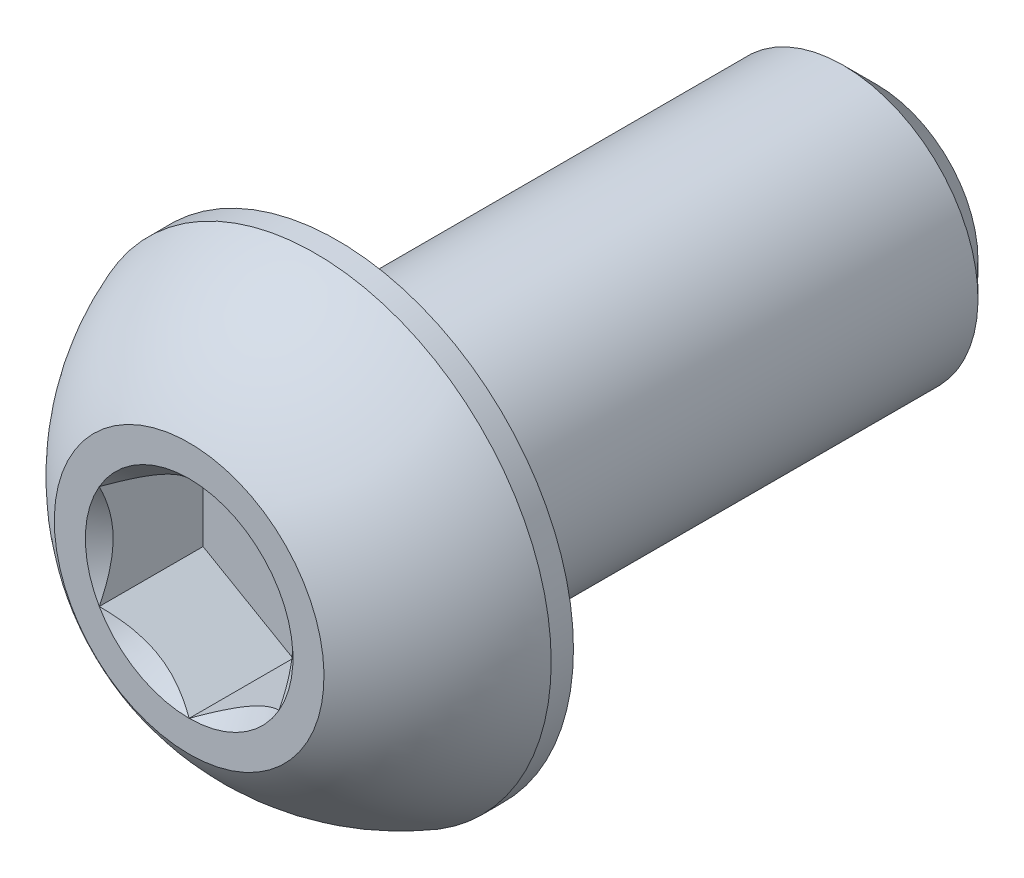
ISO-10303-21;
HEADER;
FILE_DESCRIPTION(('STEP AP214'),'2;1');
FILE_NAME('part.step','',(''),(''),'','','');
FILE_SCHEMA(('AUTOMOTIVE_DESIGN { 1 0 10303 214 1 1 1 1 }'));
ENDSEC;
DATA;
#1=APPLICATION_CONTEXT('core data for automotive mechanical design processes');
#2=APPLICATION_PROTOCOL_DEFINITION('international standard','automotive_design',2000,#1);
#3=PRODUCT_CONTEXT('',#1,'mechanical');
#4=PRODUCT('Part','Part','',(#3));
#5=PRODUCT_RELATED_PRODUCT_CATEGORY('part','',(#4));
#6=PRODUCT_DEFINITION_FORMATION('','',#4);
#7=PRODUCT_DEFINITION_CONTEXT('part definition',#1,'design');
#8=PRODUCT_DEFINITION('design','',#6,#7);
#9=PRODUCT_DEFINITION_SHAPE('','',#8);
#10=(LENGTH_UNIT() NAMED_UNIT(*) SI_UNIT(.MILLI.,.METRE.));
#11=(NAMED_UNIT(*) PLANE_ANGLE_UNIT() SI_UNIT($,.RADIAN.));
#12=(NAMED_UNIT(*) SI_UNIT($,.STERADIAN.) SOLID_ANGLE_UNIT());
#13=UNCERTAINTY_MEASURE_WITH_UNIT(LENGTH_MEASURE(1.E-05),#10,'distance_accuracy_value','');
#14=(GEOMETRIC_REPRESENTATION_CONTEXT(3) GLOBAL_UNCERTAINTY_ASSIGNED_CONTEXT((#13)) GLOBAL_UNIT_ASSIGNED_CONTEXT((#10,
#11,#12)) REPRESENTATION_CONTEXT('',''));
#15=CARTESIAN_POINT('',(0.,0.,0.));
#16=DIRECTION('',(0.,0.,1.));
#17=DIRECTION('',(1.,0.,0.));
#18=AXIS2_PLACEMENT_3D('',#15,#16,#17);
#19=CARTESIAN_POINT('',(0.,-3.,-15.3));
#20=DIRECTION('',(0.,0.,-1.));
#21=DIRECTION('',(0.,1.,0.));
#22=AXIS2_PLACEMENT_3D('',#19,#20,#21);
#23=PLANE('',#22);
#24=CARTESIAN_POINT('',(0.,0.,-15.3));
#25=DIRECTION('',(0.,0.,-1.));
#26=DIRECTION('',(0.,1.,0.));
#27=AXIS2_PLACEMENT_3D('',#24,#25,#26);
#28=CIRCLE('',#27,2.25);
#29=CARTESIAN_POINT('',(0.,2.25,-15.3));
#30=VERTEX_POINT('',#29);
#31=EDGE_CURVE('E174',#30,#30,#28,.T.);
#32=ORIENTED_EDGE('',*,*,#31,.T.);
#33=EDGE_LOOP('',(#32));
#34=FACE_BOUND('',#33,.T.);
#35=ADVANCED_FACE('F34',(#34),#23,.T.);
#36=CARTESIAN_POINT('',(0.,0.,-15.3));
#37=DIRECTION('',(0.,0.,-1.));
#38=DIRECTION('',(0.,1.,0.));
#39=AXIS2_PLACEMENT_3D('',#36,#37,#38);
#40=CYLINDRICAL_SURFACE('',#39,3.);
#41=CARTESIAN_POINT('',(0.,0.,-14.55));
#42=DIRECTION('',(0.,0.,-1.));
#43=DIRECTION('',(0.,1.,0.));
#44=AXIS2_PLACEMENT_3D('',#41,#42,#43);
#45=CIRCLE('',#44,3.);
#46=CARTESIAN_POINT('',(0.,3.,-14.55));
#47=VERTEX_POINT('',#46);
#48=EDGE_CURVE('E48',#47,#47,#45,.F.);
#49=ORIENTED_EDGE('',*,*,#48,.T.);
#50=EDGE_LOOP('',(#49));
#51=FACE_BOUND('',#50,.T.);
#52=CARTESIAN_POINT('',(0.,0.,-3.3));
#53=DIRECTION('',(0.,0.,1.));
#54=DIRECTION('',(1.,0.,0.));
#55=AXIS2_PLACEMENT_3D('',#52,#53,#54);
#56=CIRCLE('',#55,3.);
#57=CARTESIAN_POINT('',(3.,0.,-3.3));
#58=VERTEX_POINT('',#57);
#59=EDGE_CURVE('E171',#58,#58,#56,.F.);
#60=ORIENTED_EDGE('',*,*,#59,.T.);
#61=EDGE_LOOP('',(#60));
#62=FACE_BOUND('',#61,.T.);
#63=ADVANCED_FACE('F179',(#51,#62),#40,.T.);
#64=CARTESIAN_POINT('',(0.,0.,-15.3));
#65=DIRECTION('',(0.,0.,1.));
#66=DIRECTION('',(0.,-1.,0.));
#67=AXIS2_PLACEMENT_3D('',#64,#65,#66);
#68=CONICAL_SURFACE('',#67,2.25,0.785398163397448);
#69=ORIENTED_EDGE('',*,*,#48,.F.);
#70=EDGE_LOOP('',(#69));
#71=FACE_BOUND('',#70,.T.);
#72=ORIENTED_EDGE('',*,*,#31,.F.);
#73=EDGE_LOOP('',(#72));
#74=FACE_BOUND('',#73,.T.);
#75=ADVANCED_FACE('F36',(#71,#74),#68,.T.);
#76=CARTESIAN_POINT('',(0.,0.,-4.71132352941176));
#77=DIRECTION('',(0.,0.,1.));
#78=DIRECTION('',(0.,-1.,0.));
#79=AXIS2_PLACEMENT_3D('',#76,#77,#78);
#80=SPHERICAL_SURFACE('',#79,5.58538892099636);
#81=CARTESIAN_POINT('',(0.,0.,0.));
#82=DIRECTION('',(0.,0.,1.));
#83=DIRECTION('',(1.,0.,0.));
#84=AXIS2_PLACEMENT_3D('',#81,#82,#83);
#85=CIRCLE('',#84,3.);
#86=CARTESIAN_POINT('',(0.,-3.,0.));
#87=VERTEX_POINT('',#86);
#88=EDGE_CURVE('E168',#87,#87,#85,.T.);
#89=CARTESIAN_POINT('',(0.,0.,-2.805));
#90=DIRECTION('',(0.,0.,1.));
#91=DIRECTION('',(1.,0.,0.));
#92=AXIS2_PLACEMENT_3D('',#89,#90,#91);
#93=CIRCLE('',#92,5.25);
#94=CARTESIAN_POINT('',(0.,-5.25,-2.805));
#95=VERTEX_POINT('',#94);
#96=EDGE_CURVE('E162',#95,#95,#93,.T.);
#97=CARTESIAN_POINT('',(0.,-3.,0.));
#98=CARTESIAN_POINT('',(0.,-3.03216841047471,-0.0204836076687075));
#99=CARTESIAN_POINT('',(0.,-3.06412696701745,-0.041296774706015));
#100=CARTESIAN_POINT('',(0.,-3.12761110680185,-0.0835732798883759));
#101=CARTESIAN_POINT('',(0.,-3.1591366900435,-0.105036618033429));
#102=CARTESIAN_POINT('',(0.,-3.22174161778856,-0.148604517801824));
#103=CARTESIAN_POINT('',(0.,-3.25282096229196,-0.170709079425165));
#104=CARTESIAN_POINT('',(0.,-3.3145203830256,-0.215550136391723));
#105=CARTESIAN_POINT('',(0.,-3.34514045925583,-0.238286631734939));
#106=CARTESIAN_POINT('',(0.,-3.40590849355866,-0.284382020830629));
#107=CARTESIAN_POINT('',(0.,-3.43605645163127,-0.307740914583101));
#108=CARTESIAN_POINT('',(0.,-3.49586760131366,-0.355071298801884));
#109=CARTESIAN_POINT('',(0.,-3.52553079292345,-0.379042789268194));
#110=CARTESIAN_POINT('',(0.,-3.58435996382991,-0.427588309600938));
#111=CARTESIAN_POINT('',(0.,-3.61352594312657,-0.452162339467372));
#112=CARTESIAN_POINT('',(0.,-3.67134845242053,-0.501902628105114));
#113=CARTESIAN_POINT('',(0.,-3.70000498241782,-0.527068886876422));
#114=CARTESIAN_POINT('',(0.,-3.7567965698069,-0.577983074450792));
#115=CARTESIAN_POINT('',(0.,-3.78493162719868,-0.603731003253854));
#116=CARTESIAN_POINT('',(0.,-3.84066846488057,-0.65579772794287));
#117=CARTESIAN_POINT('',(0.,-3.86827024517066,-0.682116523828823));
#118=CARTESIAN_POINT('',(0.,-3.92292894789283,-0.735313940225864));
#119=CARTESIAN_POINT('',(0.,-3.94998587032491,-0.762192560736952));
#120=CARTESIAN_POINT('',(0.,-4.00354350517958,-0.816498349041451));
#121=CARTESIAN_POINT('',(0.,-4.03004421760217,-0.843925516834863));
#122=CARTESIAN_POINT('',(0.,-4.08247831365261,-0.899316892210194));
#123=CARTESIAN_POINT('',(0.,-4.10841169728045,-0.927281099792113));
#124=CARTESIAN_POINT('',(0.,-4.1597002549878,-0.983734821927126));
#125=CARTESIAN_POINT('',(0.,-4.18505542906731,-1.01222433648022));
#126=CARTESIAN_POINT('',(0.,-4.23517692952119,-1.06971671933959));
#127=CARTESIAN_POINT('',(0.,-4.25994325589556,-1.09871958764587));
#128=CARTESIAN_POINT('',(0.,-4.30887666984256,-1.15722650940808));
#129=CARTESIAN_POINT('',(0.,-4.33304375741518,-1.18673056286401));
#130=CARTESIAN_POINT('',(0.,-4.38076855408201,-1.24622747604199));
#131=CARTESIAN_POINT('',(0.,-4.40432626317621,-1.27622033576403));
#132=CARTESIAN_POINT('',(0.,-4.45082241888372,-1.33668227750444));
#133=CARTESIAN_POINT('',(0.,-4.47376086549703,-1.3671513595228));
#134=CARTESIAN_POINT('',(0.,-4.51900887206146,-1.4285529620796));
#135=CARTESIAN_POINT('',(0.,-4.54131843201258,-1.45948548261803));
#136=CARTESIAN_POINT('',(0.,-4.58529930493053,-1.52180098399588));
#137=CARTESIAN_POINT('',(0.,-4.60697061789735,-1.5531839648353));
#138=CARTESIAN_POINT('',(0.,-4.64966590431095,-1.61638721959847));
#139=CARTESIAN_POINT('',(0.,-4.67068987775773,-1.64820749352221));
#140=CARTESIAN_POINT('',(0.,-4.71208166419702,-1.71227198376418));
#141=CARTESIAN_POINT('',(0.,-4.73244947718953,-1.74451620008241));
#142=CARTESIAN_POINT('',(0.,-4.77252039708775,-1.80941504655213));
#143=CARTESIAN_POINT('',(0.,-4.79222350399347,-1.84206967670363));
#144=CARTESIAN_POINT('',(0.,-4.83095674497554,-1.90777565008234));
#145=CARTESIAN_POINT('',(0.,-4.84998687905189,-1.94082699330955));
#146=CARTESIAN_POINT('',(0.,-4.8873661899807,-2.00731252563814));
#147=CARTESIAN_POINT('',(0.,-4.90571536683316,-2.04074671473953));
#148=CARTESIAN_POINT('',(0.,-4.94172506465618,-2.10798391097428));
#149=CARTESIAN_POINT('',(0.,-4.95938558562673,-2.14178691810765));
#150=CARTESIAN_POINT('',(0.,-4.99401056185103,-2.20974756786458));
#151=CARTESIAN_POINT('',(0.,-5.01097501710478,-2.24390521048815));
#152=CARTESIAN_POINT('',(0.,-5.04420074452798,-2.31256079972767));
#153=CARTESIAN_POINT('',(0.,-5.06046201669743,-2.34705874634363));
#154=CARTESIAN_POINT('',(0.,-5.09227455404011,-2.41638046989934));
#155=CARTESIAN_POINT('',(0.,-5.10782581921333,-2.45120424683909));
#156=CARTESIAN_POINT('',(0.,-5.13821182242717,-2.52116301839372));
#157=CARTESIAN_POINT('',(0.,-5.15304656046779,-2.5562980130086));
#158=CARTESIAN_POINT('',(0.,-5.18199326796146,-2.62686448517116));
#159=CARTESIAN_POINT('',(0.,-5.19610523741451,-2.66229596271883));
#160=CARTESIAN_POINT('',(0.,-5.22360055144049,-2.7334405099534));
#161=CARTESIAN_POINT('',(0.,-5.23698389601341,-2.76915357964029));
#162=CARTESIAN_POINT('',(0.,-5.25,-2.805));
#163=B_SPLINE_CURVE_WITH_KNOTS('',3,(#97,#98,#99,#100,#101,#102,#103,#104,#105,#106,#107,#108,
#109,#110,#111,#112,#113,#114,#115,#116,#117,#118,#119,#120,#121,#122,#123,#124,#125,#126,#127,
#128,#129,#130,#131,#132,#133,#134,#135,#136,#137,#138,#139,#140,#141,#142,#143,#144,#145,#146,
#147,#148,#149,#150,#151,#152,#153,#154,#155,#156,#157,#158,#159,#160,#161,#162),.UNSPECIFIED.,
.F.,.F.,(4,2,2,2,2,2,2,2,2,2,2,2,2,2,2,2,2,2,2,2,2,2,2,2,2,2,2,2,2,2,2,2,4),(0.,
0.114407188898183,0.228814377796368,0.343221566694552,0.457628755592736,0.57203594449092,
0.686443133389104,0.800850322287287,0.915257511185472,1.02966470008366,1.14407188898184,
1.25847907788002,1.37288626677821,1.48729345567639,1.60170064457457,1.71610783347276,
1.83051502237094,1.94492221126913,2.05932940016731,2.17373658906549,2.28814377796368,
2.40255096686186,2.51695815576005,2.63136534465823,2.74577253355641,2.8601797224546,
2.97458691135278,3.08899410025097,3.20340128914915,3.31780847804733,3.43221566694552,
3.5466228558437,3.66103004474188),.UNSPECIFIED.);
#164=EDGE_CURVE('BSEAM184',#87,#95,#163,.T.);
#165=ORIENTED_EDGE('',*,*,#88,.F.);
#166=ORIENTED_EDGE('',*,*,#96,.T.);
#167=ORIENTED_EDGE('',*,*,#164,.T.);
#168=ORIENTED_EDGE('',*,*,#164,.F.);
#169=EDGE_LOOP('',(#165,#167,#166,#168));
#170=FACE_BOUND('',#169,.T.);
#171=ADVANCED_FACE('F184',(#170),#80,.T.);
#172=CARTESIAN_POINT('',(0.,-3.,0.));
#173=DIRECTION('',(0.,0.,-1.));
#174=DIRECTION('',(-1.,0.,0.));
#175=AXIS2_PLACEMENT_3D('',#172,#173,#174);
#176=PLANE('',#175);
#177=CARTESIAN_POINT('',(0.,0.,0.));
#178=DIRECTION('',(0.,0.,1.));
#179=DIRECTION('',(1.,0.,0.));
#180=AXIS2_PLACEMENT_3D('',#177,#178,#179);
#181=CIRCLE('',#180,2.3094010767585);
#182=CARTESIAN_POINT('',(-2.,1.15470053837925,0.));
#183=VERTEX_POINT('',#182);
#184=CARTESIAN_POINT('',(-2.,-1.15470053837925,0.));
#185=VERTEX_POINT('',#184);
#186=EDGE_CURVE('E61',#183,#185,#181,.T.);
#187=ORIENTED_EDGE('',*,*,#186,.F.);
#188=CARTESIAN_POINT('',(0.,2.3094010767585,0.));
#189=VERTEX_POINT('',#188);
#190=EDGE_CURVE('E133',#189,#183,#181,.T.);
#191=ORIENTED_EDGE('',*,*,#190,.F.);
#192=CARTESIAN_POINT('',(2.,1.15470053837925,0.));
#193=VERTEX_POINT('',#192);
#194=EDGE_CURVE('E130',#193,#189,#181,.T.);
#195=ORIENTED_EDGE('',*,*,#194,.F.);
#196=CARTESIAN_POINT('',(2.,-1.15470053837925,0.));
#197=VERTEX_POINT('',#196);
#198=EDGE_CURVE('E101',#197,#193,#181,.T.);
#199=ORIENTED_EDGE('',*,*,#198,.F.);
#200=CARTESIAN_POINT('',(0.,-2.3094010767585,0.));
#201=VERTEX_POINT('',#200);
#202=EDGE_CURVE('E93',#201,#197,#181,.T.);
#203=ORIENTED_EDGE('',*,*,#202,.F.);
#204=EDGE_CURVE('E54',#185,#201,#181,.T.);
#205=ORIENTED_EDGE('',*,*,#204,.F.);
#206=EDGE_LOOP('',(#187,#191,#195,#199,#203,#205));
#207=FACE_BOUND('',#206,.T.);
#208=ORIENTED_EDGE('',*,*,#88,.T.);
#209=EDGE_LOOP('',(#208));
#210=FACE_BOUND('',#209,.T.);
#211=ADVANCED_FACE('F127',(#207,#210),#176,.F.);
#212=CARTESIAN_POINT('',(0.,-5.25,-3.3));
#213=DIRECTION('',(0.,0.,1.));
#214=DIRECTION('',(1.,0.,0.));
#215=AXIS2_PLACEMENT_3D('',#212,#213,#214);
#216=PLANE('',#215);
#217=ORIENTED_EDGE('',*,*,#59,.F.);
#218=EDGE_LOOP('',(#217));
#219=FACE_BOUND('',#218,.T.);
#220=CARTESIAN_POINT('',(0.,0.,-3.3));
#221=DIRECTION('',(0.,0.,1.));
#222=DIRECTION('',(1.,0.,0.));
#223=AXIS2_PLACEMENT_3D('',#220,#221,#222);
#224=CIRCLE('',#223,5.25);
#225=CARTESIAN_POINT('',(5.25,0.,-3.3));
#226=VERTEX_POINT('',#225);
#227=EDGE_CURVE('E165',#226,#226,#224,.T.);
#228=ORIENTED_EDGE('',*,*,#227,.F.);
#229=EDGE_LOOP('',(#228));
#230=FACE_BOUND('',#229,.T.);
#231=ADVANCED_FACE('F198',(#219,#230),#216,.F.);
#232=CARTESIAN_POINT('',(0.,0.,0.));
#233=DIRECTION('',(0.,0.,1.));
#234=DIRECTION('',(1.,0.,0.));
#235=AXIS2_PLACEMENT_3D('',#232,#233,#234);
#236=CYLINDRICAL_SURFACE('',#235,5.25);
#237=ORIENTED_EDGE('',*,*,#96,.F.);
#238=EDGE_LOOP('',(#237));
#239=FACE_BOUND('',#238,.T.);
#240=ORIENTED_EDGE('',*,*,#227,.T.);
#241=EDGE_LOOP('',(#240));
#242=FACE_BOUND('',#241,.T.);
#243=ADVANCED_FACE('F201',(#239,#242),#236,.T.);
#244=CARTESIAN_POINT('',(0.,0.,0.));
#245=DIRECTION('',(0.,0.,1.));
#246=DIRECTION('',(1.,0.,0.));
#247=AXIS2_PLACEMENT_3D('',#244,#245,#246);
#248=CONICAL_SURFACE('',#247,2.3094010767585,0.78539816339745);
#249=ORIENTED_EDGE('',*,*,#198,.T.);
#250=CARTESIAN_POINT('',(2.,-2.30294417292923,0.740771355027721));
#251=CARTESIAN_POINT('',(2.,-2.24687002663712,0.698443273625964));
#252=CARTESIAN_POINT('',(2.,-2.19048190536959,0.656525156864338));
#253=CARTESIAN_POINT('',(2.,-2.07695390496424,0.573690417861017));
#254=CARTESIAN_POINT('',(2.,-2.01981384066454,0.532774049668074));
#255=CARTESIAN_POINT('',(2.,-1.90424016804776,0.451833452018563));
#256=CARTESIAN_POINT('',(2.,-1.8457999674391,0.411818591559868));
#257=CARTESIAN_POINT('',(2.,-1.7279274546176,0.333288993664294));
#258=CARTESIAN_POINT('',(2.,-1.66849521292324,0.294774150243142));
#259=CARTESIAN_POINT('',(2.,-1.4816299571002,0.177640651604295));
#260=CARTESIAN_POINT('',(2.,-1.35220318163536,0.102145901729644));
#261=CARTESIAN_POINT('',(2.,-1.08689521592924,-0.035950649005619));
#262=CARTESIAN_POINT('',(2.,-0.951037763938191,-0.0985959140965044));
#263=CARTESIAN_POINT('',(2.,-0.747111912259408,-0.175236456124857));
#264=CARTESIAN_POINT('',(2.,-0.682064034147875,-0.197232820080877));
#265=CARTESIAN_POINT('',(2.,-0.550398103294751,-0.23600331233986));
#266=CARTESIAN_POINT('',(2.,-0.483779942722474,-0.252777080878817));
#267=CARTESIAN_POINT('',(2.,-0.350484328847653,-0.279951742115555));
#268=CARTESIAN_POINT('',(2.,-0.283829489364785,-0.290461823258314));
#269=CARTESIAN_POINT('',(2.,-0.149806987139376,-0.304903914455084));
#270=CARTESIAN_POINT('',(2.,-0.0824394489341211,-0.308837055266886));
#271=CARTESIAN_POINT('',(2.,0.0499055622944906,-0.309833523066283));
#272=CARTESIAN_POINT('',(2.,0.114881285143173,-0.307140355149591));
#273=CARTESIAN_POINT('',(2.,0.244275921482762,-0.295569929577308));
#274=CARTESIAN_POINT('',(2.,0.308694780266754,-0.286692071166776));
#275=CARTESIAN_POINT('',(2.,0.437599788610706,-0.263086340703852));
#276=CARTESIAN_POINT('',(2.,0.502067428644596,-0.248258916553488));
#277=CARTESIAN_POINT('',(2.,0.629594322598307,-0.21354211637203));
#278=CARTESIAN_POINT('',(2.,0.692653693883151,-0.193653163893724));
#279=CARTESIAN_POINT('',(2.,0.891187889210545,-0.123553020743801));
#280=CARTESIAN_POINT('',(2.,1.02383545707306,-0.065358199678491));
#281=CARTESIAN_POINT('',(2.,1.28290932150074,0.0640305754595763));
#282=CARTESIAN_POINT('',(2.,1.4093111258757,0.135271231414841));
#283=CARTESIAN_POINT('',(2.,1.59200441438963,0.24644199187472));
#284=CARTESIAN_POINT('',(2.,1.65027549026191,0.283182190337375));
#285=CARTESIAN_POINT('',(2.,1.76581760389243,0.358214514183766));
#286=CARTESIAN_POINT('',(2.,1.82308856543105,0.396506757118039));
#287=CARTESIAN_POINT('',(2.,1.93629654762084,0.474042264081225));
#288=CARTESIAN_POINT('',(2.,1.99224062500539,0.513275276133585));
#289=CARTESIAN_POINT('',(2.,2.103364240299,0.592778830736516));
#290=CARTESIAN_POINT('',(2.,2.15854398422468,0.633049085000597));
#291=CARTESIAN_POINT('',(2.,2.21340370692659,0.673744238145942));
#292=B_SPLINE_CURVE_WITH_KNOTS('',3,(#250,#251,#252,#253,#254,#255,#256,#257,#258,#259,#260,
#261,#262,#263,#264,#265,#266,#267,#268,#269,#270,#271,#272,#273,#274,#275,#276,#277,#278,#279,
#280,#281,#282,#283,#284,#285,#286,#287,#288,#289,#290,#291),.UNSPECIFIED.,.F.,.F.,(4,2,2,2,2,2,
2,2,2,2,2,2,2,2,2,2,2,2,2,2,4),(0.,0.210772731976891,0.421598374658589,0.634057554623488,
0.84650169587017,1.29562155455624,1.74319622821645,1.94902062110207,2.15485918928326,
2.35699582502635,2.5590977043214,2.75388435553556,2.94868993014815,3.14690093452586,
3.34509535789702,3.77838155837654,4.21325029921625,4.41989056685647,4.62654651460921,
4.8315237711129,5.03644465914085),.UNSPECIFIED.);
#293=EDGE_CURVE('E11',#197,#193,#292,.T.);
#294=ORIENTED_EDGE('',*,*,#293,.F.);
#295=EDGE_LOOP('',(#249,#294));
#296=FACE_BOUND('',#295,.T.);
#297=ADVANCED_FACE('F105',(#296),#248,.F.);
#298=ORIENTED_EDGE('',*,*,#194,.T.);
#299=CARTESIAN_POINT('',(2.0002,1.15458506832541,0.000115478713659204));
#300=CARTESIAN_POINT('',(1.93144696596929,1.19427965103065,-0.0395469097744084));
#301=CARTESIAN_POINT('',(1.86154425786449,1.23463799837204,-0.0768800177158387));
#302=CARTESIAN_POINT('',(1.71900475544956,1.31693321846145,-0.145236314863858));
#303=CARTESIAN_POINT('',(1.64635440243464,1.35887791933134,-0.17622146626278));
#304=CARTESIAN_POINT('',(1.49985839894603,1.44345742638069,-0.229299783455858));
#305=CARTESIAN_POINT('',(1.4260500647537,1.48607068799507,-0.251526372823389));
#306=CARTESIAN_POINT('',(1.27680836816474,1.57223542169503,-0.28577118332492));
#307=CARTESIAN_POINT('',(1.20137956608185,1.61578426088223,-0.297814970855866));
#308=CARTESIAN_POINT('',(1.07138449932892,1.69083694766536,-0.308681488094429));
#309=CARTESIAN_POINT('',(1.01698621602989,1.72224381117151,-0.31029024639003));
#310=CARTESIAN_POINT('',(0.908278544480306,1.78500621460364,-0.307581122401289));
#311=CARTESIAN_POINT('',(0.85396919407866,1.81636173267754,-0.303261162242026));
#312=CARTESIAN_POINT('',(0.745863272410661,1.87877671565355,-0.288940432590095));
#313=CARTESIAN_POINT('',(0.692067343445207,1.90983580972306,-0.278933307237994));
#314=CARTESIAN_POINT('',(0.585405737694426,1.97141691651547,-0.253787569750341));
#315=CARTESIAN_POINT('',(0.532539989929287,2.00193897021859,-0.23864935095776));
#316=CARTESIAN_POINT('',(0.397120266910155,2.08012358375727,-0.19370549657081));
#317=CARTESIAN_POINT('',(0.31540616515052,2.12730124240478,-0.160511160574184));
#318=CARTESIAN_POINT('',(0.195252962742197,2.19667172615922,-0.104474176828631));
#319=CARTESIAN_POINT('',(0.155657147890822,2.21953238052245,-0.0847852970530606));
#320=CARTESIAN_POINT('',(0.0771990411121269,2.26483018959124,-0.0436126816351292));
#321=CARTESIAN_POINT('',(0.0383363164062588,2.28726759416161,-0.0221300483487535));
#322=CARTESIAN_POINT('',(-0.00020000000000097,2.30951654681234,0.000115478713659226));
#323=B_SPLINE_CURVE_WITH_KNOTS('',3,(#299,#300,#301,#302,#303,#304,#305,#306,#307,#308,#309,
#310,#311,#312,#313,#314,#315,#316,#317,#318,#319,#320,#321,#322),.UNSPECIFIED.,.F.,.F.,(4,2,2,
2,2,2,2,2,2,2,2,4),(0.,0.266420613771064,0.534393751523389,0.798110374376915,1.06116288956936,
1.24939906803722,1.43770123566248,1.62621426093932,1.81471283831913,2.11415604834145,
2.26347170717791,2.41269626969771),.UNSPECIFIED.);
#324=EDGE_CURVE('E132',#193,#189,#323,.T.);
#325=ORIENTED_EDGE('',*,*,#324,.F.);
#326=EDGE_LOOP('',(#298,#325));
#327=FACE_BOUND('',#326,.T.);
#328=ADVANCED_FACE('F286',(#327),#248,.F.);
#329=ORIENTED_EDGE('',*,*,#190,.T.);
#330=CARTESIAN_POINT('',(0.000199999999999167,2.30951654681234,0.000115478713659074));
#331=CARTESIAN_POINT('',(-0.0685530340307064,2.26982196410711,-0.0395469097744084));
#332=CARTESIAN_POINT('',(-0.138455742135512,2.22946361676572,-0.0768800177158387));
#333=CARTESIAN_POINT('',(-0.280995244550437,2.1471683966763,-0.145236314863857));
#334=CARTESIAN_POINT('',(-0.353645597565359,2.10522369580642,-0.17622146626278));
#335=CARTESIAN_POINT('',(-0.500141601053972,2.02064418875706,-0.229299783455858));
#336=CARTESIAN_POINT('',(-0.573949935246295,1.97803092714269,-0.251526372823389));
#337=CARTESIAN_POINT('',(-0.723191631835265,1.89186619344273,-0.28577118332492));
#338=CARTESIAN_POINT('',(-0.798620433918152,1.84831735425552,-0.297814970855866));
#339=CARTESIAN_POINT('',(-0.928615500671079,1.7732646674724,-0.308681488094429));
#340=CARTESIAN_POINT('',(-0.983013783970109,1.74185780396625,-0.31029024639003));
#341=CARTESIAN_POINT('',(-1.09172145551969,1.67909540053412,-0.307581122401289));
#342=CARTESIAN_POINT('',(-1.14603080592134,1.64773988246021,-0.303261162242026));
#343=CARTESIAN_POINT('',(-1.25413672758934,1.5853248994842,-0.288940432590095));
#344=CARTESIAN_POINT('',(-1.30793265655479,1.55426580541469,-0.278933307237994));
#345=CARTESIAN_POINT('',(-1.41459426230557,1.49268469862228,-0.253787569750341));
#346=CARTESIAN_POINT('',(-1.46746001007071,1.46216264491917,-0.238649350957761));
#347=CARTESIAN_POINT('',(-1.60287973308984,1.38397803138049,-0.19370549657081));
#348=CARTESIAN_POINT('',(-1.68459383484948,1.33680037273297,-0.160511160574185));
#349=CARTESIAN_POINT('',(-1.8047470372578,1.26742988897853,-0.104474176828631));
#350=CARTESIAN_POINT('',(-1.84434285210918,1.24456923461531,-0.0847852970530604));
#351=CARTESIAN_POINT('',(-1.92280095888787,1.19927142554652,-0.0436126816351288));
#352=CARTESIAN_POINT('',(-1.96166368359374,1.17683402097614,-0.0221300483487531));
#353=CARTESIAN_POINT('',(-2.0002,1.15458506832541,0.000115478713659235));
#354=B_SPLINE_CURVE_WITH_KNOTS('',3,(#330,#331,#332,#333,#334,#335,#336,#337,#338,#339,#340,
#341,#342,#343,#344,#345,#346,#347,#348,#349,#350,#351,#352,#353),.UNSPECIFIED.,.F.,.F.,(4,2,2,
2,2,2,2,2,2,2,2,4),(0.,0.266420613771064,0.534393751523388,0.798110374376914,1.06116288956936,
1.24939906803722,1.43770123566247,1.62621426093932,1.81471283831913,2.11415604834145,
2.2634717071779,2.41269626969771),.UNSPECIFIED.);
#355=EDGE_CURVE('E137',#189,#183,#354,.T.);
#356=ORIENTED_EDGE('',*,*,#355,.F.);
#357=EDGE_LOOP('',(#329,#356));
#358=FACE_BOUND('',#357,.T.);
#359=ADVANCED_FACE('F140',(#358),#248,.F.);
#360=ORIENTED_EDGE('',*,*,#186,.T.);
#361=CARTESIAN_POINT('',(-2.,-2.30294417292923,0.740771355027722));
#362=CARTESIAN_POINT('',(-2.,-2.24687002663712,0.698443273625965));
#363=CARTESIAN_POINT('',(-2.,-2.19048190536959,0.656525156864339));
#364=CARTESIAN_POINT('',(-2.,-2.07695390496424,0.573690417861019));
#365=CARTESIAN_POINT('',(-2.,-2.01981384066454,0.532774049668075));
#366=CARTESIAN_POINT('',(-2.,-1.90424016804776,0.451833452018564));
#367=CARTESIAN_POINT('',(-2.,-1.8457999674391,0.411818591559869));
#368=CARTESIAN_POINT('',(-2.,-1.7279274546176,0.333288993664294));
#369=CARTESIAN_POINT('',(-2.,-1.66849521292324,0.294774150243143));
#370=CARTESIAN_POINT('',(-2.,-1.4816299571002,0.177640651604295));
#371=CARTESIAN_POINT('',(-2.,-1.35220318163536,0.102145901729644));
#372=CARTESIAN_POINT('',(-2.,-1.08689521592925,-0.0359506490056186));
#373=CARTESIAN_POINT('',(-2.,-0.951037763938192,-0.0985959140965041));
#374=CARTESIAN_POINT('',(-2.,-0.747111912259409,-0.175236456124857));
#375=CARTESIAN_POINT('',(-2.,-0.682064034147876,-0.197232820080877));
#376=CARTESIAN_POINT('',(-2.,-0.550398103294752,-0.23600331233986));
#377=CARTESIAN_POINT('',(-2.,-0.483779942722475,-0.252777080878817));
#378=CARTESIAN_POINT('',(-2.,-0.350484328847654,-0.279951742115555));
#379=CARTESIAN_POINT('',(-2.,-0.283829489364785,-0.290461823258314));
#380=CARTESIAN_POINT('',(-2.,-0.149806987139376,-0.304903914455084));
#381=CARTESIAN_POINT('',(-2.,-0.0824394489341216,-0.308837055266886));
#382=CARTESIAN_POINT('',(-2.,0.0499055622944898,-0.309833523066282));
#383=CARTESIAN_POINT('',(-2.,0.114881285143172,-0.307140355149591));
#384=CARTESIAN_POINT('',(-2.,0.244275921482761,-0.295569929577307));
#385=CARTESIAN_POINT('',(-2.,0.308694780266753,-0.286692071166776));
#386=CARTESIAN_POINT('',(-2.,0.437599788610705,-0.263086340703851));
#387=CARTESIAN_POINT('',(-2.,0.502067428644595,-0.248258916553488));
#388=CARTESIAN_POINT('',(-2.,0.629594322598306,-0.21354211637203));
#389=CARTESIAN_POINT('',(-2.,0.69265369388315,-0.193653163893724));
#390=CARTESIAN_POINT('',(-2.,0.891187889210544,-0.123553020743801));
#391=CARTESIAN_POINT('',(-2.,1.02383545707306,-0.0653581996784918));
#392=CARTESIAN_POINT('',(-2.,1.28290932150074,0.0640305754595755));
#393=CARTESIAN_POINT('',(-2.,1.4093111258757,0.13527123141484));
#394=CARTESIAN_POINT('',(-2.,1.59200441438963,0.246441991874719));
#395=CARTESIAN_POINT('',(-2.,1.65027549026191,0.283182190337373));
#396=CARTESIAN_POINT('',(-2.,1.76581760389242,0.358214514183764));
#397=CARTESIAN_POINT('',(-2.,1.82308856543104,0.396506757118038));
#398=CARTESIAN_POINT('',(-2.,1.93629654762084,0.474042264081224));
#399=CARTESIAN_POINT('',(-2.,1.99224062500538,0.513275276133583));
#400=CARTESIAN_POINT('',(-2.,2.10336424029899,0.592778830736514));
#401=CARTESIAN_POINT('',(-2.,2.15854398422468,0.633049085000595));
#402=CARTESIAN_POINT('',(-2.,2.21340370692658,0.67374423814594));
#403=B_SPLINE_CURVE_WITH_KNOTS('',3,(#361,#362,#363,#364,#365,#366,#367,#368,#369,#370,#371,
#372,#373,#374,#375,#376,#377,#378,#379,#380,#381,#382,#383,#384,#385,#386,#387,#388,#389,#390,
#391,#392,#393,#394,#395,#396,#397,#398,#399,#400,#401,#402),.UNSPECIFIED.,.F.,.F.,(4,2,2,2,2,2,
2,2,2,2,2,2,2,2,2,2,2,2,2,2,4),(0.,0.210772731976891,0.421598374658589,0.634057554623488,
0.846501695870171,1.29562155455624,1.74319622821645,1.94902062110207,2.15485918928326,
2.35699582502635,2.5590977043214,2.75388435553556,2.94868993014815,3.14690093452586,
3.34509535789702,3.77838155837654,4.21325029921625,4.41989056685647,4.62654651460921,
4.83152377111289,5.03644465914085),.UNSPECIFIED.);
#404=EDGE_CURVE('E144',#183,#185,#403,.F.);
#405=ORIENTED_EDGE('',*,*,#404,.F.);
#406=EDGE_LOOP('',(#360,#405));
#407=FACE_BOUND('',#406,.T.);
#408=ADVANCED_FACE('F280',(#407),#248,.F.);
#409=ORIENTED_EDGE('',*,*,#204,.T.);
#410=CARTESIAN_POINT('',(-2.0002,-1.15458506832541,0.000115478713659206));
#411=CARTESIAN_POINT('',(-1.93144696596929,-1.19427965103065,-0.0395469097744084));
#412=CARTESIAN_POINT('',(-1.86154425786449,-1.23463799837204,-0.0768800177158387));
#413=CARTESIAN_POINT('',(-1.71900475544956,-1.31693321846145,-0.145236314863857));
#414=CARTESIAN_POINT('',(-1.64635440243464,-1.35887791933134,-0.17622146626278));
#415=CARTESIAN_POINT('',(-1.49985839894603,-1.44345742638069,-0.229299783455858));
#416=CARTESIAN_POINT('',(-1.42605006475371,-1.48607068799507,-0.251526372823389));
#417=CARTESIAN_POINT('',(-1.27680836816474,-1.57223542169503,-0.28577118332492));
#418=CARTESIAN_POINT('',(-1.20137956608185,-1.61578426088223,-0.297814970855866));
#419=CARTESIAN_POINT('',(-1.07138449932892,-1.69083694766536,-0.308681488094429));
#420=CARTESIAN_POINT('',(-1.01698621602989,-1.72224381117151,-0.31029024639003));
#421=CARTESIAN_POINT('',(-0.908278544480307,-1.78500621460364,-0.307581122401289));
#422=CARTESIAN_POINT('',(-0.853969194078661,-1.81636173267754,-0.303261162242026));
#423=CARTESIAN_POINT('',(-0.745863272410662,-1.87877671565355,-0.288940432590095));
#424=CARTESIAN_POINT('',(-0.692067343445208,-1.90983580972306,-0.278933307237994));
#425=CARTESIAN_POINT('',(-0.585405737694427,-1.97141691651547,-0.253787569750341));
#426=CARTESIAN_POINT('',(-0.532539989929288,-2.00193897021859,-0.238649350957761));
#427=CARTESIAN_POINT('',(-0.397120266910156,-2.08012358375727,-0.193705496570811));
#428=CARTESIAN_POINT('',(-0.315406165150522,-2.12730124240478,-0.160511160574185));
#429=CARTESIAN_POINT('',(-0.195252962742198,-2.19667172615922,-0.104474176828631));
#430=CARTESIAN_POINT('',(-0.155657147890823,-2.21953238052245,-0.0847852970530607));
#431=CARTESIAN_POINT('',(-0.0771990411121279,-2.26483018959124,-0.0436126816351295));
#432=CARTESIAN_POINT('',(-0.0383363164062597,-2.28726759416161,-0.0221300483487539));
#433=CARTESIAN_POINT('',(0.000200000000000139,-2.30951654681234,0.000115478713658744));
#434=B_SPLINE_CURVE_WITH_KNOTS('',3,(#410,#411,#412,#413,#414,#415,#416,#417,#418,#419,#420,
#421,#422,#423,#424,#425,#426,#427,#428,#429,#430,#431,#432,#433),.UNSPECIFIED.,.F.,.F.,(4,2,2,
2,2,2,2,2,2,2,2,4),(0.,0.266420613771064,0.534393751523388,0.798110374376914,1.06116288956936,
1.24939906803722,1.43770123566247,1.62621426093932,1.81471283831913,2.11415604834145,
2.2634717071779,2.41269626969771),.UNSPECIFIED.);
#435=EDGE_CURVE('E117',#185,#201,#434,.T.);
#436=ORIENTED_EDGE('',*,*,#435,.F.);
#437=EDGE_LOOP('',(#409,#436));
#438=FACE_BOUND('',#437,.T.);
#439=ADVANCED_FACE('F228',(#438),#248,.F.);
#440=ORIENTED_EDGE('',*,*,#202,.T.);
#441=CARTESIAN_POINT('',(-0.000199999999999622,-2.30951654681234,0.000115478713659074));
#442=CARTESIAN_POINT('',(0.0685530340307058,-2.26982196410711,-0.0395469097744083));
#443=CARTESIAN_POINT('',(0.138455742135512,-2.22946361676572,-0.0768800177158385));
#444=CARTESIAN_POINT('',(0.280995244550436,-2.1471683966763,-0.145236314863857));
#445=CARTESIAN_POINT('',(0.353645597565358,-2.10522369580642,-0.17622146626278));
#446=CARTESIAN_POINT('',(0.500141601053971,-2.02064418875706,-0.229299783455858));
#447=CARTESIAN_POINT('',(0.573949935246294,-1.97803092714269,-0.25152637282339));
#448=CARTESIAN_POINT('',(0.723191631835264,-1.89186619344273,-0.28577118332492));
#449=CARTESIAN_POINT('',(0.798620433918152,-1.84831735425552,-0.297814970855866));
#450=CARTESIAN_POINT('',(0.928615500671079,-1.7732646674724,-0.308681488094429));
#451=CARTESIAN_POINT('',(0.983013783970109,-1.74185780396625,-0.31029024639003));
#452=CARTESIAN_POINT('',(1.09172145551969,-1.67909540053412,-0.307581122401289));
#453=CARTESIAN_POINT('',(1.14603080592134,-1.64773988246021,-0.303261162242026));
#454=CARTESIAN_POINT('',(1.25413672758934,-1.5853248994842,-0.288940432590095));
#455=CARTESIAN_POINT('',(1.30793265655479,-1.55426580541469,-0.278933307237994));
#456=CARTESIAN_POINT('',(1.41459426230557,-1.49268469862228,-0.253787569750341));
#457=CARTESIAN_POINT('',(1.46746001007071,-1.46216264491917,-0.238649350957761));
#458=CARTESIAN_POINT('',(1.60287973308984,-1.38397803138049,-0.19370549657081));
#459=CARTESIAN_POINT('',(1.68459383484948,-1.33680037273297,-0.160511160574185));
#460=CARTESIAN_POINT('',(1.8047470372578,-1.26742988897853,-0.104474176828631));
#461=CARTESIAN_POINT('',(1.84434285210918,-1.24456923461531,-0.0847852970530604));
#462=CARTESIAN_POINT('',(1.92280095888787,-1.19927142554652,-0.043612681635129));
#463=CARTESIAN_POINT('',(1.96166368359374,-1.17683402097614,-0.0221300483487534));
#464=CARTESIAN_POINT('',(2.0002,-1.15458506832541,0.000115478713659034));
#465=B_SPLINE_CURVE_WITH_KNOTS('',3,(#441,#442,#443,#444,#445,#446,#447,#448,#449,#450,#451,
#452,#453,#454,#455,#456,#457,#458,#459,#460,#461,#462,#463,#464),.UNSPECIFIED.,.F.,.F.,(4,2,2,
2,2,2,2,2,2,2,2,4),(0.,0.266420613771063,0.534393751523388,0.798110374376914,1.06116288956936,
1.24939906803722,1.43770123566247,1.62621426093932,1.81471283831913,2.11415604834145,
2.26347170717791,2.41269626969771),.UNSPECIFIED.);
#466=EDGE_CURVE('E97',#201,#197,#465,.T.);
#467=ORIENTED_EDGE('',*,*,#466,.F.);
#468=EDGE_LOOP('',(#440,#467));
#469=FACE_BOUND('',#468,.T.);
#470=ADVANCED_FACE('F95',(#469),#248,.F.);
#471=CARTESIAN_POINT('',(2.,-1.15470053837925,-2.31));
#472=DIRECTION('',(0.,0.,1.));
#473=DIRECTION('',(1.,0.,0.));
#474=AXIS2_PLACEMENT_3D('',#471,#472,#473);
#475=PLANE('',#474);
#476=DIRECTION('',(0.866025403784438,0.5,0.));
#477=VECTOR('',#476,1.);
#478=CARTESIAN_POINT('',(0.,-2.3094010767585,-2.31));
#479=LINE('',#478,#477);
#480=CARTESIAN_POINT('',(0.,-2.3094010767585,-2.31));
#481=VERTEX_POINT('',#480);
#482=CARTESIAN_POINT('',(2.,-1.15470053837925,-2.31));
#483=VERTEX_POINT('',#482);
#484=EDGE_CURVE('E116',#481,#483,#479,.T.);
#485=ORIENTED_EDGE('',*,*,#484,.T.);
#486=DIRECTION('',(0.,1.,0.));
#487=VECTOR('',#486,1.);
#488=CARTESIAN_POINT('',(2.,-1.15470053837925,-2.31));
#489=LINE('',#488,#487);
#490=CARTESIAN_POINT('',(2.,1.15470053837925,-2.31));
#491=VERTEX_POINT('',#490);
#492=EDGE_CURVE('E121',#483,#491,#489,.T.);
#493=ORIENTED_EDGE('',*,*,#492,.T.);
#494=DIRECTION('',(-0.866025403784439,0.5,0.));
#495=VECTOR('',#494,1.);
#496=CARTESIAN_POINT('',(2.,1.15470053837925,-2.31));
#497=LINE('',#496,#495);
#498=CARTESIAN_POINT('',(0.,2.3094010767585,-2.31));
#499=VERTEX_POINT('',#498);
#500=EDGE_CURVE('E270',#491,#499,#497,.T.);
#501=ORIENTED_EDGE('',*,*,#500,.T.);
#502=DIRECTION('',(-0.866025403784438,-0.5,0.));
#503=VECTOR('',#502,1.);
#504=CARTESIAN_POINT('',(0.,2.3094010767585,-2.31));
#505=LINE('',#504,#503);
#506=CARTESIAN_POINT('',(-2.,1.15470053837925,-2.31));
#507=VERTEX_POINT('',#506);
#508=EDGE_CURVE('E153',#499,#507,#505,.T.);
#509=ORIENTED_EDGE('',*,*,#508,.T.);
#510=DIRECTION('',(0.,-1.,0.));
#511=VECTOR('',#510,1.);
#512=CARTESIAN_POINT('',(-2.,1.15470053837925,-2.31));
#513=LINE('',#512,#511);
#514=CARTESIAN_POINT('',(-2.,-1.15470053837925,-2.31));
#515=VERTEX_POINT('',#514);
#516=EDGE_CURVE('E274',#507,#515,#513,.T.);
#517=ORIENTED_EDGE('',*,*,#516,.T.);
#518=DIRECTION('',(0.866025403784439,-0.5,0.));
#519=VECTOR('',#518,1.);
#520=CARTESIAN_POINT('',(-2.,-1.15470053837925,-2.31));
#521=LINE('',#520,#519);
#522=EDGE_CURVE('E124',#515,#481,#521,.T.);
#523=ORIENTED_EDGE('',*,*,#522,.T.);
#524=EDGE_LOOP('',(#485,#493,#501,#509,#517,#523));
#525=FACE_BOUND('',#524,.T.);
#526=ADVANCED_FACE('F227',(#525),#475,.T.);
#527=CARTESIAN_POINT('',(2.,-1.15470053837925,-2.31));
#528=DIRECTION('',(1.,0.,0.));
#529=DIRECTION('',(0.,0.,-1.));
#530=AXIS2_PLACEMENT_3D('',#527,#528,#529);
#531=PLANE('',#530);
#532=DIRECTION('',(0.,0.,1.));
#533=VECTOR('',#532,1.);
#534=CARTESIAN_POINT('',(2.,-1.15470053837925,-2.31));
#535=LINE('',#534,#533);
#536=EDGE_CURVE('E113',#483,#197,#535,.T.);
#537=ORIENTED_EDGE('',*,*,#536,.T.);
#538=ORIENTED_EDGE('',*,*,#293,.T.);
#539=DIRECTION('',(0.,0.,1.));
#540=VECTOR('',#539,1.);
#541=CARTESIAN_POINT('',(2.,1.15470053837925,-2.31));
#542=LINE('',#541,#540);
#543=EDGE_CURVE('E123',#491,#193,#542,.T.);
#544=ORIENTED_EDGE('',*,*,#543,.F.);
#545=ORIENTED_EDGE('',*,*,#492,.F.);
#546=EDGE_LOOP('',(#537,#538,#544,#545));
#547=FACE_BOUND('',#546,.T.);
#548=ADVANCED_FACE('F119',(#547),#531,.F.);
#549=CARTESIAN_POINT('',(2.,1.15470053837925,-2.31));
#550=DIRECTION('',(0.5,0.866025403784439,0.));
#551=DIRECTION('',(-0.866025403784439,0.5,0.));
#552=AXIS2_PLACEMENT_3D('',#549,#550,#551);
#553=PLANE('',#552);
#554=ORIENTED_EDGE('',*,*,#543,.T.);
#555=ORIENTED_EDGE('',*,*,#324,.T.);
#556=DIRECTION('',(0.,0.,1.));
#557=VECTOR('',#556,1.);
#558=CARTESIAN_POINT('',(0.,2.3094010767585,-2.31));
#559=LINE('',#558,#557);
#560=EDGE_CURVE('E149',#499,#189,#559,.T.);
#561=ORIENTED_EDGE('',*,*,#560,.F.);
#562=ORIENTED_EDGE('',*,*,#500,.F.);
#563=EDGE_LOOP('',(#554,#555,#561,#562));
#564=FACE_BOUND('',#563,.T.);
#565=ADVANCED_FACE('F147',(#564),#553,.F.);
#566=CARTESIAN_POINT('',(0.,2.3094010767585,-2.31));
#567=DIRECTION('',(-0.5,0.866025403784439,0.));
#568=DIRECTION('',(-0.866025403784439,-0.5,0.));
#569=AXIS2_PLACEMENT_3D('',#566,#567,#568);
#570=PLANE('',#569);
#571=ORIENTED_EDGE('',*,*,#560,.T.);
#572=ORIENTED_EDGE('',*,*,#355,.T.);
#573=DIRECTION('',(0.,0.,1.));
#574=VECTOR('',#573,1.);
#575=CARTESIAN_POINT('',(-2.,1.15470053837925,-2.31));
#576=LINE('',#575,#574);
#577=EDGE_CURVE('E155',#507,#183,#576,.T.);
#578=ORIENTED_EDGE('',*,*,#577,.F.);
#579=ORIENTED_EDGE('',*,*,#508,.F.);
#580=EDGE_LOOP('',(#571,#572,#578,#579));
#581=FACE_BOUND('',#580,.T.);
#582=ADVANCED_FACE('F151',(#581),#570,.F.);
#583=CARTESIAN_POINT('',(-2.,1.15470053837925,-2.31));
#584=DIRECTION('',(-1.,0.,0.));
#585=DIRECTION('',(0.,-1.,0.));
#586=AXIS2_PLACEMENT_3D('',#583,#584,#585);
#587=PLANE('',#586);
#588=ORIENTED_EDGE('',*,*,#577,.T.);
#589=ORIENTED_EDGE('',*,*,#404,.T.);
#590=DIRECTION('',(0.,0.,1.));
#591=VECTOR('',#590,1.);
#592=CARTESIAN_POINT('',(-2.,-1.15470053837925,-2.31));
#593=LINE('',#592,#591);
#594=EDGE_CURVE('E157',#515,#185,#593,.T.);
#595=ORIENTED_EDGE('',*,*,#594,.F.);
#596=ORIENTED_EDGE('',*,*,#516,.F.);
#597=EDGE_LOOP('',(#588,#589,#595,#596));
#598=FACE_BOUND('',#597,.T.);
#599=ADVANCED_FACE('F249',(#598),#587,.F.);
#600=CARTESIAN_POINT('',(-2.,-1.15470053837925,-2.31));
#601=DIRECTION('',(-0.5,-0.866025403784439,0.));
#602=DIRECTION('',(0.866025403784439,-0.5,0.));
#603=AXIS2_PLACEMENT_3D('',#600,#601,#602);
#604=PLANE('',#603);
#605=ORIENTED_EDGE('',*,*,#594,.T.);
#606=ORIENTED_EDGE('',*,*,#435,.T.);
#607=DIRECTION('',(0.,0.,1.));
#608=VECTOR('',#607,1.);
#609=CARTESIAN_POINT('',(0.,-2.3094010767585,-2.31));
#610=LINE('',#609,#608);
#611=EDGE_CURVE('E115',#481,#201,#610,.T.);
#612=ORIENTED_EDGE('',*,*,#611,.F.);
#613=ORIENTED_EDGE('',*,*,#522,.F.);
#614=EDGE_LOOP('',(#605,#606,#612,#613));
#615=FACE_BOUND('',#614,.T.);
#616=ADVANCED_FACE('F208',(#615),#604,.F.);
#617=CARTESIAN_POINT('',(0.,-2.3094010767585,-2.31));
#618=DIRECTION('',(0.5,-0.866025403784439,0.));
#619=DIRECTION('',(0.866025403784439,0.5,0.));
#620=AXIS2_PLACEMENT_3D('',#617,#618,#619);
#621=PLANE('',#620);
#622=ORIENTED_EDGE('',*,*,#611,.T.);
#623=ORIENTED_EDGE('',*,*,#466,.T.);
#624=ORIENTED_EDGE('',*,*,#536,.F.);
#625=ORIENTED_EDGE('',*,*,#484,.F.);
#626=EDGE_LOOP('',(#622,#623,#624,#625));
#627=FACE_BOUND('',#626,.T.);
#628=ADVANCED_FACE('F111',(#627),#621,.F.);
#629=CLOSED_SHELL('',(#35,#63,#75,#171,#211,#231,#243,#297,#328,#359,#408,#439,#470,#526,#548,
#565,#582,#599,#616,#628));
#630=MANIFOLD_SOLID_BREP('B2',#629);
#631=ADVANCED_BREP_SHAPE_REPRESENTATION('',(#18,#630),#14);
#632=SHAPE_DEFINITION_REPRESENTATION(#9,#631);
ENDSEC;
END-ISO-10303-21;
